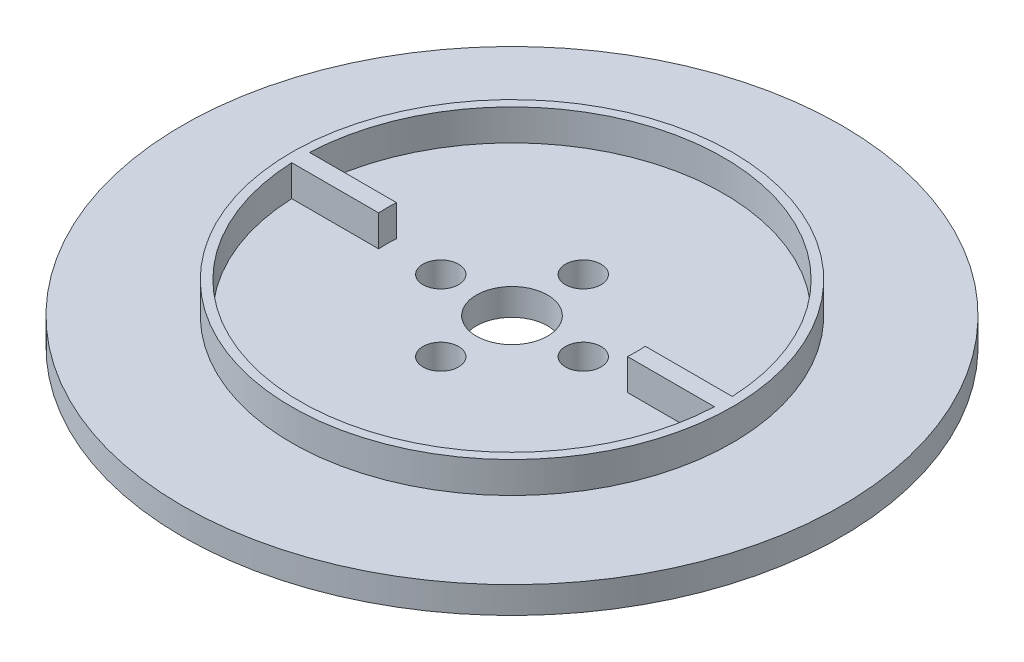
ISO-10303-21;
HEADER;
FILE_DESCRIPTION(('STEP AP214'),'2;1');
FILE_NAME('part.step','',(''),(''),'','','');
FILE_SCHEMA(('AUTOMOTIVE_DESIGN { 1 0 10303 214 1 1 1 1 }'));
ENDSEC;
DATA;
#1=APPLICATION_CONTEXT('core data for automotive mechanical design processes');
#2=APPLICATION_PROTOCOL_DEFINITION('international standard','automotive_design',2000,#1);
#3=PRODUCT_CONTEXT('',#1,'mechanical');
#4=PRODUCT('Part','Part','',(#3));
#5=PRODUCT_RELATED_PRODUCT_CATEGORY('part','',(#4));
#6=PRODUCT_DEFINITION_FORMATION('','',#4);
#7=PRODUCT_DEFINITION_CONTEXT('part definition',#1,'design');
#8=PRODUCT_DEFINITION('design','',#6,#7);
#9=PRODUCT_DEFINITION_SHAPE('','',#8);
#10=(LENGTH_UNIT() NAMED_UNIT(*) SI_UNIT(.MILLI.,.METRE.));
#11=(NAMED_UNIT(*) PLANE_ANGLE_UNIT() SI_UNIT($,.RADIAN.));
#12=(NAMED_UNIT(*) SI_UNIT($,.STERADIAN.) SOLID_ANGLE_UNIT());
#13=UNCERTAINTY_MEASURE_WITH_UNIT(LENGTH_MEASURE(1.E-05),#10,'distance_accuracy_value','');
#14=(GEOMETRIC_REPRESENTATION_CONTEXT(3) GLOBAL_UNCERTAINTY_ASSIGNED_CONTEXT((#13)) GLOBAL_UNIT_ASSIGNED_CONTEXT((#10,
#11,#12)) REPRESENTATION_CONTEXT('',''));
#15=CARTESIAN_POINT('',(0.,0.,0.));
#16=DIRECTION('',(0.,0.,1.));
#17=DIRECTION('',(1.,0.,0.));
#18=AXIS2_PLACEMENT_3D('',#15,#16,#17);
#19=CARTESIAN_POINT('',(0.,3.,0.));
#20=DIRECTION('',(0.,1.,0.));
#21=DIRECTION('',(0.,0.,1.));
#22=AXIS2_PLACEMENT_3D('',#19,#20,#21);
#23=PLANE('',#22);
#24=CARTESIAN_POINT('',(0.,3.,0.));
#25=DIRECTION('',(0.,1.,0.));
#26=DIRECTION('',(0.,0.,1.));
#27=AXIS2_PLACEMENT_3D('',#24,#25,#26);
#28=CIRCLE('',#27,37.);
#29=CARTESIAN_POINT('',(0.,3.,37.));
#30=VERTEX_POINT('',#29);
#31=EDGE_CURVE('E11',#30,#30,#28,.T.);
#32=ORIENTED_EDGE('',*,*,#31,.T.);
#33=EDGE_LOOP('',(#32));
#34=FACE_BOUND('',#33,.T.);
#35=CARTESIAN_POINT('',(0.,3.,0.));
#36=DIRECTION('',(0.,1.,0.));
#37=DIRECTION('',(0.,0.,1.));
#38=AXIS2_PLACEMENT_3D('',#35,#36,#37);
#39=CIRCLE('',#38,24.75);
#40=CARTESIAN_POINT('',(0.,3.,-24.75));
#41=VERTEX_POINT('',#40);
#42=EDGE_CURVE('E185',#41,#41,#39,.F.);
#43=ORIENTED_EDGE('',*,*,#42,.T.);
#44=EDGE_LOOP('',(#43));
#45=FACE_BOUND('',#44,.T.);
#46=ADVANCED_FACE('F41',(#34,#45),#23,.T.);
#47=CARTESIAN_POINT('',(0.,3.,0.));
#48=DIRECTION('',(0.,-1.,0.));
#49=DIRECTION('',(0.,0.,-1.));
#50=AXIS2_PLACEMENT_3D('',#47,#48,#49);
#51=CYLINDRICAL_SURFACE('',#50,37.);
#52=ORIENTED_EDGE('',*,*,#31,.F.);
#53=EDGE_LOOP('',(#52));
#54=FACE_BOUND('',#53,.T.);
#55=CARTESIAN_POINT('',(0.,0.,0.));
#56=DIRECTION('',(0.,1.,0.));
#57=DIRECTION('',(0.,0.,1.));
#58=AXIS2_PLACEMENT_3D('',#55,#56,#57);
#59=CIRCLE('',#58,37.);
#60=CARTESIAN_POINT('',(0.,0.,37.));
#61=VERTEX_POINT('',#60);
#62=EDGE_CURVE('E51',#61,#61,#59,.T.);
#63=ORIENTED_EDGE('',*,*,#62,.T.);
#64=EDGE_LOOP('',(#63));
#65=FACE_BOUND('',#64,.T.);
#66=ADVANCED_FACE('F43',(#54,#65),#51,.T.);
#67=CARTESIAN_POINT('',(0.,0.,0.));
#68=DIRECTION('',(0.,1.,0.));
#69=DIRECTION('',(0.,0.,1.));
#70=AXIS2_PLACEMENT_3D('',#67,#68,#69);
#71=PLANE('',#70);
#72=CARTESIAN_POINT('',(8.,0.,0.));
#73=DIRECTION('',(0.,1.,0.));
#74=DIRECTION('',(0.,0.,1.));
#75=AXIS2_PLACEMENT_3D('',#72,#73,#74);
#76=CIRCLE('',#75,2.);
#77=CARTESIAN_POINT('',(8.,0.,2.));
#78=VERTEX_POINT('',#77);
#79=EDGE_CURVE('E307',#78,#78,#76,.T.);
#80=ORIENTED_EDGE('',*,*,#79,.T.);
#81=EDGE_LOOP('',(#80));
#82=FACE_BOUND('',#81,.T.);
#83=CARTESIAN_POINT('',(0.,0.,8.));
#84=DIRECTION('',(0.,1.,0.));
#85=DIRECTION('',(0.,0.,1.));
#86=AXIS2_PLACEMENT_3D('',#83,#84,#85);
#87=CIRCLE('',#86,2.);
#88=CARTESIAN_POINT('',(0.,0.,10.));
#89=VERTEX_POINT('',#88);
#90=EDGE_CURVE('E311',#89,#89,#87,.T.);
#91=ORIENTED_EDGE('',*,*,#90,.T.);
#92=EDGE_LOOP('',(#91));
#93=FACE_BOUND('',#92,.T.);
#94=CARTESIAN_POINT('',(-8.,0.,0.));
#95=DIRECTION('',(0.,1.,0.));
#96=DIRECTION('',(0.,0.,1.));
#97=AXIS2_PLACEMENT_3D('',#94,#95,#96);
#98=CIRCLE('',#97,2.);
#99=CARTESIAN_POINT('',(-8.,0.,1.99999999999994));
#100=VERTEX_POINT('',#99);
#101=EDGE_CURVE('E315',#100,#100,#98,.T.);
#102=ORIENTED_EDGE('',*,*,#101,.T.);
#103=EDGE_LOOP('',(#102));
#104=FACE_BOUND('',#103,.T.);
#105=CARTESIAN_POINT('',(0.,0.,-8.));
#106=DIRECTION('',(0.,1.,0.));
#107=DIRECTION('',(0.,0.,1.));
#108=AXIS2_PLACEMENT_3D('',#105,#106,#107);
#109=CIRCLE('',#108,2.);
#110=CARTESIAN_POINT('',(0.,0.,-6.));
#111=VERTEX_POINT('',#110);
#112=EDGE_CURVE('E319',#111,#111,#109,.T.);
#113=ORIENTED_EDGE('',*,*,#112,.T.);
#114=EDGE_LOOP('',(#113));
#115=FACE_BOUND('',#114,.T.);
#116=CARTESIAN_POINT('',(0.,0.,0.));
#117=DIRECTION('',(0.,1.,0.));
#118=DIRECTION('',(0.,0.,1.));
#119=AXIS2_PLACEMENT_3D('',#116,#117,#118);
#120=CIRCLE('',#119,4.);
#121=CARTESIAN_POINT('',(0.,0.,4.));
#122=VERTEX_POINT('',#121);
#123=EDGE_CURVE('E45',#122,#122,#120,.T.);
#124=ORIENTED_EDGE('',*,*,#123,.T.);
#125=EDGE_LOOP('',(#124));
#126=FACE_BOUND('',#125,.T.);
#127=ORIENTED_EDGE('',*,*,#62,.F.);
#128=EDGE_LOOP('',(#127));
#129=FACE_BOUND('',#128,.T.);
#130=ADVANCED_FACE('F213',(#82,#93,#104,#115,#126,#129),#71,.F.);
#131=CARTESIAN_POINT('',(0.,6.5,0.));
#132=DIRECTION('',(0.,-1.,0.));
#133=DIRECTION('',(0.,0.,-1.));
#134=AXIS2_PLACEMENT_3D('',#131,#132,#133);
#135=CYLINDRICAL_SURFACE('',#134,23.75);
#136=DIRECTION('',(0.,-1.,0.));
#137=VECTOR('',#136,1.);
#138=CARTESIAN_POINT('',(-23.7289380293346,6.5,-1.));
#139=LINE('',#138,#137);
#140=CARTESIAN_POINT('',(-23.7289380293346,6.5,-1.));
#141=VERTEX_POINT('',#140);
#142=CARTESIAN_POINT('',(-23.7289380293346,3.,-1.));
#143=VERTEX_POINT('',#142);
#144=EDGE_CURVE('E157',#141,#143,#139,.T.);
#145=ORIENTED_EDGE('',*,*,#144,.T.);
#146=CARTESIAN_POINT('',(0.,3.,0.));
#147=DIRECTION('',(0.,1.,0.));
#148=DIRECTION('',(0.,0.,1.));
#149=AXIS2_PLACEMENT_3D('',#146,#147,#148);
#150=CIRCLE('',#149,23.75);
#151=CARTESIAN_POINT('',(23.7289380293346,3.,-1.));
#152=VERTEX_POINT('',#151);
#153=EDGE_CURVE('E113',#143,#152,#150,.F.);
#154=ORIENTED_EDGE('',*,*,#153,.T.);
#155=DIRECTION('',(0.,-1.,0.));
#156=VECTOR('',#155,1.);
#157=CARTESIAN_POINT('',(23.7289380293346,6.5,-1.));
#158=LINE('',#157,#156);
#159=CARTESIAN_POINT('',(23.7289380293346,6.5,-1.));
#160=VERTEX_POINT('',#159);
#161=EDGE_CURVE('E107',#160,#152,#158,.T.);
#162=ORIENTED_EDGE('',*,*,#161,.F.);
#163=CARTESIAN_POINT('',(0.,6.5,0.));
#164=DIRECTION('',(0.,1.,0.));
#165=DIRECTION('',(0.,0.,1.));
#166=AXIS2_PLACEMENT_3D('',#163,#164,#165);
#167=CIRCLE('',#166,23.75);
#168=EDGE_CURVE('E111',#160,#141,#167,.T.);
#169=ORIENTED_EDGE('',*,*,#168,.T.);
#170=EDGE_LOOP('',(#145,#154,#162,#169));
#171=FACE_BOUND('',#170,.T.);
#172=ADVANCED_FACE('F110',(#171),#135,.F.);
#173=CARTESIAN_POINT('',(0.,6.5,-1.));
#174=DIRECTION('',(0.,0.,-1.));
#175=DIRECTION('',(-1.,0.,0.));
#176=AXIS2_PLACEMENT_3D('',#173,#174,#175);
#177=PLANE('',#176);
#178=ORIENTED_EDGE('',*,*,#161,.T.);
#179=DIRECTION('',(-1.,0.,0.));
#180=VECTOR('',#179,1.);
#181=CARTESIAN_POINT('',(0.,3.,-1.));
#182=LINE('',#181,#180);
#183=CARTESIAN_POINT('',(13.9642400437689,3.,-1.));
#184=VERTEX_POINT('',#183);
#185=EDGE_CURVE('E59',#152,#184,#182,.T.);
#186=ORIENTED_EDGE('',*,*,#185,.T.);
#187=DIRECTION('',(0.,-1.,0.));
#188=VECTOR('',#187,1.);
#189=CARTESIAN_POINT('',(13.9642400437689,6.5,-1.));
#190=LINE('',#189,#188);
#191=CARTESIAN_POINT('',(13.9642400437689,6.5,-1.));
#192=VERTEX_POINT('',#191);
#193=EDGE_CURVE('E118',#192,#184,#190,.T.);
#194=ORIENTED_EDGE('',*,*,#193,.F.);
#195=DIRECTION('',(1.,0.,0.));
#196=VECTOR('',#195,1.);
#197=CARTESIAN_POINT('',(0.,6.5,-1.));
#198=LINE('',#197,#196);
#199=EDGE_CURVE('E124',#192,#160,#198,.T.);
#200=ORIENTED_EDGE('',*,*,#199,.T.);
#201=EDGE_LOOP('',(#178,#186,#194,#200));
#202=FACE_BOUND('',#201,.T.);
#203=ADVANCED_FACE('F132',(#202),#177,.T.);
#204=CARTESIAN_POINT('',(0.,6.5,0.));
#205=DIRECTION('',(0.,-1.,0.));
#206=DIRECTION('',(0.,0.,-1.));
#207=AXIS2_PLACEMENT_3D('',#204,#205,#206);
#208=CYLINDRICAL_SURFACE('',#207,14.);
#209=ORIENTED_EDGE('',*,*,#193,.T.);
#210=CARTESIAN_POINT('',(0.,3.,0.));
#211=DIRECTION('',(0.,1.,0.));
#212=DIRECTION('',(0.,0.,1.));
#213=AXIS2_PLACEMENT_3D('',#210,#211,#212);
#214=CIRCLE('',#213,14.);
#215=CARTESIAN_POINT('',(13.9642400437689,3.,1.));
#216=VERTEX_POINT('',#215);
#217=EDGE_CURVE('E64',#184,#216,#214,.F.);
#218=ORIENTED_EDGE('',*,*,#217,.T.);
#219=DIRECTION('',(0.,-1.,0.));
#220=VECTOR('',#219,1.);
#221=CARTESIAN_POINT('',(13.9642400437689,6.5,1.));
#222=LINE('',#221,#220);
#223=CARTESIAN_POINT('',(13.9642400437689,6.5,1.));
#224=VERTEX_POINT('',#223);
#225=EDGE_CURVE('E176',#224,#216,#222,.T.);
#226=ORIENTED_EDGE('',*,*,#225,.F.);
#227=CARTESIAN_POINT('',(0.,6.5,0.));
#228=DIRECTION('',(0.,1.,0.));
#229=DIRECTION('',(0.,0.,1.));
#230=AXIS2_PLACEMENT_3D('',#227,#228,#229);
#231=CIRCLE('',#230,14.);
#232=EDGE_CURVE('E135',#224,#192,#231,.T.);
#233=ORIENTED_EDGE('',*,*,#232,.T.);
#234=EDGE_LOOP('',(#209,#218,#226,#233));
#235=FACE_BOUND('',#234,.T.);
#236=ADVANCED_FACE('F281',(#235),#208,.F.);
#237=CARTESIAN_POINT('',(0.,6.5,1.));
#238=DIRECTION('',(0.,0.,-1.));
#239=DIRECTION('',(-1.,0.,0.));
#240=AXIS2_PLACEMENT_3D('',#237,#238,#239);
#241=PLANE('',#240);
#242=DIRECTION('',(-1.,0.,0.));
#243=VECTOR('',#242,1.);
#244=CARTESIAN_POINT('',(0.,3.,1.));
#245=LINE('',#244,#243);
#246=CARTESIAN_POINT('',(23.7289380293346,3.,1.));
#247=VERTEX_POINT('',#246);
#248=EDGE_CURVE('E200',#247,#216,#245,.T.);
#249=ORIENTED_EDGE('',*,*,#248,.F.);
#250=DIRECTION('',(0.,-1.,0.));
#251=VECTOR('',#250,1.);
#252=CARTESIAN_POINT('',(23.7289380293346,6.5,1.));
#253=LINE('',#252,#251);
#254=CARTESIAN_POINT('',(23.7289380293346,6.5,1.));
#255=VERTEX_POINT('',#254);
#256=EDGE_CURVE('E172',#255,#247,#253,.T.);
#257=ORIENTED_EDGE('',*,*,#256,.F.);
#258=DIRECTION('',(1.,0.,0.));
#259=VECTOR('',#258,1.);
#260=CARTESIAN_POINT('',(0.,6.5,1.));
#261=LINE('',#260,#259);
#262=EDGE_CURVE('E138',#224,#255,#261,.T.);
#263=ORIENTED_EDGE('',*,*,#262,.F.);
#264=ORIENTED_EDGE('',*,*,#225,.T.);
#265=EDGE_LOOP('',(#249,#257,#263,#264));
#266=FACE_BOUND('',#265,.T.);
#267=ADVANCED_FACE('F279',(#266),#241,.F.);
#268=CARTESIAN_POINT('',(0.,6.5,0.));
#269=DIRECTION('',(0.,-1.,0.));
#270=DIRECTION('',(0.,0.,-1.));
#271=AXIS2_PLACEMENT_3D('',#268,#269,#270);
#272=CYLINDRICAL_SURFACE('',#271,23.75);
#273=ORIENTED_EDGE('',*,*,#256,.T.);
#274=CARTESIAN_POINT('',(0.,3.,0.));
#275=DIRECTION('',(0.,1.,0.));
#276=DIRECTION('',(0.,0.,1.));
#277=AXIS2_PLACEMENT_3D('',#274,#275,#276);
#278=CIRCLE('',#277,23.75);
#279=CARTESIAN_POINT('',(-23.7289380293346,3.,1.));
#280=VERTEX_POINT('',#279);
#281=EDGE_CURVE('E196',#247,#280,#278,.F.);
#282=ORIENTED_EDGE('',*,*,#281,.T.);
#283=DIRECTION('',(0.,-1.,0.));
#284=VECTOR('',#283,1.);
#285=CARTESIAN_POINT('',(-23.7289380293346,6.5,1.));
#286=LINE('',#285,#284);
#287=CARTESIAN_POINT('',(-23.7289380293346,6.5,1.));
#288=VERTEX_POINT('',#287);
#289=EDGE_CURVE('E168',#288,#280,#286,.T.);
#290=ORIENTED_EDGE('',*,*,#289,.F.);
#291=CARTESIAN_POINT('',(0.,6.5,0.));
#292=DIRECTION('',(0.,1.,0.));
#293=DIRECTION('',(0.,0.,1.));
#294=AXIS2_PLACEMENT_3D('',#291,#292,#293);
#295=CIRCLE('',#294,23.75);
#296=EDGE_CURVE('E144',#288,#255,#295,.T.);
#297=ORIENTED_EDGE('',*,*,#296,.T.);
#298=EDGE_LOOP('',(#273,#282,#290,#297));
#299=FACE_BOUND('',#298,.T.);
#300=ADVANCED_FACE('F275',(#299),#272,.F.);
#301=CARTESIAN_POINT('',(0.,6.5,1.));
#302=DIRECTION('',(0.,0.,-1.));
#303=DIRECTION('',(-1.,0.,0.));
#304=AXIS2_PLACEMENT_3D('',#301,#302,#303);
#305=PLANE('',#304);
#306=DIRECTION('',(-1.,0.,0.));
#307=VECTOR('',#306,1.);
#308=CARTESIAN_POINT('',(0.,3.,1.));
#309=LINE('',#308,#307);
#310=CARTESIAN_POINT('',(-13.9642400437689,3.,1.));
#311=VERTEX_POINT('',#310);
#312=EDGE_CURVE('E193',#311,#280,#309,.T.);
#313=ORIENTED_EDGE('',*,*,#312,.F.);
#314=DIRECTION('',(0.,-1.,0.));
#315=VECTOR('',#314,1.);
#316=CARTESIAN_POINT('',(-13.9642400437689,6.5,1.));
#317=LINE('',#316,#315);
#318=CARTESIAN_POINT('',(-13.9642400437689,6.5,1.));
#319=VERTEX_POINT('',#318);
#320=EDGE_CURVE('E164',#319,#311,#317,.T.);
#321=ORIENTED_EDGE('',*,*,#320,.F.);
#322=DIRECTION('',(1.,0.,0.));
#323=VECTOR('',#322,1.);
#324=CARTESIAN_POINT('',(0.,6.5,1.));
#325=LINE('',#324,#323);
#326=EDGE_CURVE('E148',#288,#319,#325,.T.);
#327=ORIENTED_EDGE('',*,*,#326,.F.);
#328=ORIENTED_EDGE('',*,*,#289,.T.);
#329=EDGE_LOOP('',(#313,#321,#327,#328));
#330=FACE_BOUND('',#329,.T.);
#331=ADVANCED_FACE('F272',(#330),#305,.F.);
#332=CARTESIAN_POINT('',(0.,6.5,0.));
#333=DIRECTION('',(0.,-1.,0.));
#334=DIRECTION('',(0.,0.,-1.));
#335=AXIS2_PLACEMENT_3D('',#332,#333,#334);
#336=CYLINDRICAL_SURFACE('',#335,14.);
#337=ORIENTED_EDGE('',*,*,#320,.T.);
#338=CARTESIAN_POINT('',(0.,3.,0.));
#339=DIRECTION('',(0.,1.,0.));
#340=DIRECTION('',(0.,0.,1.));
#341=AXIS2_PLACEMENT_3D('',#338,#339,#340);
#342=CIRCLE('',#341,14.);
#343=CARTESIAN_POINT('',(-13.9642400437689,3.,-1.));
#344=VERTEX_POINT('',#343);
#345=EDGE_CURVE('E189',#311,#344,#342,.F.);
#346=ORIENTED_EDGE('',*,*,#345,.T.);
#347=DIRECTION('',(0.,-1.,0.));
#348=VECTOR('',#347,1.);
#349=CARTESIAN_POINT('',(-13.9642400437689,6.5,-1.));
#350=LINE('',#349,#348);
#351=CARTESIAN_POINT('',(-13.9642400437689,6.5,-1.));
#352=VERTEX_POINT('',#351);
#353=EDGE_CURVE('E160',#352,#344,#350,.T.);
#354=ORIENTED_EDGE('',*,*,#353,.F.);
#355=CARTESIAN_POINT('',(0.,6.5,0.));
#356=DIRECTION('',(0.,1.,0.));
#357=DIRECTION('',(0.,0.,1.));
#358=AXIS2_PLACEMENT_3D('',#355,#356,#357);
#359=CIRCLE('',#358,14.);
#360=EDGE_CURVE('E151',#352,#319,#359,.T.);
#361=ORIENTED_EDGE('',*,*,#360,.T.);
#362=EDGE_LOOP('',(#337,#346,#354,#361));
#363=FACE_BOUND('',#362,.T.);
#364=ADVANCED_FACE('F266',(#363),#336,.F.);
#365=CARTESIAN_POINT('',(0.,6.5,0.));
#366=DIRECTION('',(0.,-1.,0.));
#367=DIRECTION('',(0.,0.,-1.));
#368=AXIS2_PLACEMENT_3D('',#365,#366,#367);
#369=CYLINDRICAL_SURFACE('',#368,24.75);
#370=CARTESIAN_POINT('',(0.,6.5,0.));
#371=DIRECTION('',(0.,1.,0.));
#372=DIRECTION('',(0.,0.,1.));
#373=AXIS2_PLACEMENT_3D('',#370,#371,#372);
#374=CIRCLE('',#373,24.75);
#375=CARTESIAN_POINT('',(0.,6.5,-24.75));
#376=VERTEX_POINT('',#375);
#377=EDGE_CURVE('E130',#376,#376,#374,.T.);
#378=CARTESIAN_POINT('',(0.,3.,-24.75));
#379=CARTESIAN_POINT('',(0.,3.03645833333333,-24.75));
#380=CARTESIAN_POINT('',(0.,3.07291666666667,-24.75));
#381=CARTESIAN_POINT('',(0.,3.14583333333333,-24.75));
#382=CARTESIAN_POINT('',(0.,3.18229166666667,-24.75));
#383=CARTESIAN_POINT('',(0.,3.25520833333333,-24.75));
#384=CARTESIAN_POINT('',(0.,3.29166666666667,-24.75));
#385=CARTESIAN_POINT('',(0.,3.36458333333333,-24.75));
#386=CARTESIAN_POINT('',(0.,3.40104166666667,-24.75));
#387=CARTESIAN_POINT('',(0.,3.47395833333333,-24.75));
#388=CARTESIAN_POINT('',(0.,3.51041666666667,-24.75));
#389=CARTESIAN_POINT('',(0.,3.58333333333333,-24.75));
#390=CARTESIAN_POINT('',(0.,3.61979166666667,-24.75));
#391=CARTESIAN_POINT('',(0.,3.69270833333333,-24.75));
#392=CARTESIAN_POINT('',(0.,3.72916666666667,-24.75));
#393=CARTESIAN_POINT('',(0.,3.80208333333333,-24.75));
#394=CARTESIAN_POINT('',(0.,3.83854166666667,-24.75));
#395=CARTESIAN_POINT('',(0.,3.91145833333333,-24.75));
#396=CARTESIAN_POINT('',(0.,3.94791666666667,-24.75));
#397=CARTESIAN_POINT('',(0.,4.02083333333333,-24.75));
#398=CARTESIAN_POINT('',(0.,4.05729166666667,-24.75));
#399=CARTESIAN_POINT('',(0.,4.13020833333333,-24.75));
#400=CARTESIAN_POINT('',(0.,4.16666666666667,-24.75));
#401=CARTESIAN_POINT('',(0.,4.23958333333333,-24.75));
#402=CARTESIAN_POINT('',(0.,4.27604166666667,-24.75));
#403=CARTESIAN_POINT('',(0.,4.34895833333333,-24.75));
#404=CARTESIAN_POINT('',(0.,4.38541666666667,-24.75));
#405=CARTESIAN_POINT('',(0.,4.45833333333333,-24.75));
#406=CARTESIAN_POINT('',(0.,4.49479166666667,-24.75));
#407=CARTESIAN_POINT('',(0.,4.56770833333333,-24.75));
#408=CARTESIAN_POINT('',(0.,4.60416666666667,-24.75));
#409=CARTESIAN_POINT('',(0.,4.67708333333333,-24.75));
#410=CARTESIAN_POINT('',(0.,4.71354166666667,-24.75));
#411=CARTESIAN_POINT('',(0.,4.78645833333333,-24.75));
#412=CARTESIAN_POINT('',(0.,4.82291666666667,-24.75));
#413=CARTESIAN_POINT('',(0.,4.89583333333333,-24.75));
#414=CARTESIAN_POINT('',(0.,4.93229166666667,-24.75));
#415=CARTESIAN_POINT('',(0.,5.00520833333333,-24.75));
#416=CARTESIAN_POINT('',(0.,5.04166666666667,-24.75));
#417=CARTESIAN_POINT('',(0.,5.11458333333333,-24.75));
#418=CARTESIAN_POINT('',(0.,5.15104166666667,-24.75));
#419=CARTESIAN_POINT('',(0.,5.22395833333333,-24.75));
#420=CARTESIAN_POINT('',(0.,5.26041666666667,-24.75));
#421=CARTESIAN_POINT('',(0.,5.33333333333333,-24.75));
#422=CARTESIAN_POINT('',(0.,5.36979166666667,-24.75));
#423=CARTESIAN_POINT('',(0.,5.44270833333333,-24.75));
#424=CARTESIAN_POINT('',(0.,5.47916666666667,-24.75));
#425=CARTESIAN_POINT('',(0.,5.55208333333333,-24.75));
#426=CARTESIAN_POINT('',(0.,5.58854166666667,-24.75));
#427=CARTESIAN_POINT('',(0.,5.66145833333333,-24.75));
#428=CARTESIAN_POINT('',(0.,5.69791666666667,-24.75));
#429=CARTESIAN_POINT('',(0.,5.77083333333333,-24.75));
#430=CARTESIAN_POINT('',(0.,5.80729166666667,-24.75));
#431=CARTESIAN_POINT('',(0.,5.88020833333333,-24.75));
#432=CARTESIAN_POINT('',(0.,5.91666666666667,-24.75));
#433=CARTESIAN_POINT('',(0.,5.98958333333333,-24.75));
#434=CARTESIAN_POINT('',(0.,6.02604166666667,-24.75));
#435=CARTESIAN_POINT('',(0.,6.09895833333333,-24.75));
#436=CARTESIAN_POINT('',(0.,6.13541666666667,-24.75));
#437=CARTESIAN_POINT('',(0.,6.20833333333333,-24.75));
#438=CARTESIAN_POINT('',(0.,6.24479166666667,-24.75));
#439=CARTESIAN_POINT('',(0.,6.31770833333333,-24.75));
#440=CARTESIAN_POINT('',(0.,6.35416666666667,-24.75));
#441=CARTESIAN_POINT('',(0.,6.42708333333333,-24.75));
#442=CARTESIAN_POINT('',(0.,6.46354166666667,-24.75));
#443=CARTESIAN_POINT('',(0.,6.5,-24.75));
#444=B_SPLINE_CURVE_WITH_KNOTS('',3,(#378,#379,#380,#381,#382,#383,#384,#385,#386,#387,#388,
#389,#390,#391,#392,#393,#394,#395,#396,#397,#398,#399,#400,#401,#402,#403,#404,#405,#406,#407,
#408,#409,#410,#411,#412,#413,#414,#415,#416,#417,#418,#419,#420,#421,#422,#423,#424,#425,#426,
#427,#428,#429,#430,#431,#432,#433,#434,#435,#436,#437,#438,#439,#440,#441,#442,#443),
.UNSPECIFIED.,.F.,.F.,(4,2,2,2,2,2,2,2,2,2,2,2,2,2,2,2,2,2,2,2,2,2,2,2,2,2,2,2,2,2,2,2,4),(0.,
0.109375,0.21875,0.328125,0.4375,0.546875,0.65625,0.765625,0.875,0.984375,1.09375,1.203125,
1.3125,1.421875,1.53125,1.640625,1.75,1.859375,1.96875,2.078125,2.1875,2.296875,2.40625,
2.515625,2.625,2.734375,2.84375,2.953125,3.0625,3.171875,3.28125,3.390625,3.5),.UNSPECIFIED.);
#445=EDGE_CURVE('BSEAM291',#41,#376,#444,.T.);
#446=ORIENTED_EDGE('',*,*,#42,.F.);
#447=ORIENTED_EDGE('',*,*,#377,.F.);
#448=ORIENTED_EDGE('',*,*,#445,.T.);
#449=ORIENTED_EDGE('',*,*,#445,.F.);
#450=EDGE_LOOP('',(#446,#448,#447,#449));
#451=FACE_BOUND('',#450,.T.);
#452=ADVANCED_FACE('F291',(#451),#369,.T.);
#453=CARTESIAN_POINT('',(0.,6.5,-1.));
#454=DIRECTION('',(0.,0.,-1.));
#455=DIRECTION('',(-1.,0.,0.));
#456=AXIS2_PLACEMENT_3D('',#453,#454,#455);
#457=PLANE('',#456);
#458=ORIENTED_EDGE('',*,*,#353,.T.);
#459=DIRECTION('',(-1.,0.,0.));
#460=VECTOR('',#459,1.);
#461=CARTESIAN_POINT('',(0.,3.,-1.));
#462=LINE('',#461,#460);
#463=EDGE_CURVE('E117',#344,#143,#462,.T.);
#464=ORIENTED_EDGE('',*,*,#463,.T.);
#465=ORIENTED_EDGE('',*,*,#144,.F.);
#466=DIRECTION('',(1.,0.,0.));
#467=VECTOR('',#466,1.);
#468=CARTESIAN_POINT('',(0.,6.5,-1.));
#469=LINE('',#468,#467);
#470=EDGE_CURVE('E128',#141,#352,#469,.T.);
#471=ORIENTED_EDGE('',*,*,#470,.T.);
#472=EDGE_LOOP('',(#458,#464,#465,#471));
#473=FACE_BOUND('',#472,.T.);
#474=ADVANCED_FACE('F242',(#473),#457,.T.);
#475=CARTESIAN_POINT('',(0.,6.5,0.));
#476=DIRECTION('',(0.,1.,0.));
#477=DIRECTION('',(0.,0.,1.));
#478=AXIS2_PLACEMENT_3D('',#475,#476,#477);
#479=PLANE('',#478);
#480=ORIENTED_EDGE('',*,*,#377,.T.);
#481=EDGE_LOOP('',(#480));
#482=FACE_BOUND('',#481,.T.);
#483=ORIENTED_EDGE('',*,*,#168,.F.);
#484=ORIENTED_EDGE('',*,*,#199,.F.);
#485=ORIENTED_EDGE('',*,*,#232,.F.);
#486=ORIENTED_EDGE('',*,*,#262,.T.);
#487=ORIENTED_EDGE('',*,*,#296,.F.);
#488=ORIENTED_EDGE('',*,*,#326,.T.);
#489=ORIENTED_EDGE('',*,*,#360,.F.);
#490=ORIENTED_EDGE('',*,*,#470,.F.);
#491=EDGE_LOOP('',(#483,#484,#485,#486,#487,#488,#489,#490));
#492=FACE_BOUND('',#491,.T.);
#493=ADVANCED_FACE('F122',(#482,#492),#479,.T.);
#494=CARTESIAN_POINT('',(0.,3.,0.));
#495=DIRECTION('',(0.,1.,0.));
#496=DIRECTION('',(0.,0.,1.));
#497=AXIS2_PLACEMENT_3D('',#494,#495,#496);
#498=CIRCLE('',#497,4.);
#499=CARTESIAN_POINT('',(0.,3.,4.));
#500=VERTEX_POINT('',#499);
#501=EDGE_CURVE('E248',#500,#500,#498,.T.);
#502=ORIENTED_EDGE('',*,*,#501,.F.);
#503=EDGE_LOOP('',(#502));
#504=FACE_BOUND('',#503,.T.);
#505=CARTESIAN_POINT('',(8.,3.,0.));
#506=DIRECTION('',(0.,1.,0.));
#507=DIRECTION('',(0.,0.,1.));
#508=AXIS2_PLACEMENT_3D('',#505,#506,#507);
#509=CIRCLE('',#508,2.);
#510=CARTESIAN_POINT('',(8.,3.,2.));
#511=VERTEX_POINT('',#510);
#512=EDGE_CURVE('E252',#511,#511,#509,.T.);
#513=ORIENTED_EDGE('',*,*,#512,.F.);
#514=EDGE_LOOP('',(#513));
#515=FACE_BOUND('',#514,.T.);
#516=CARTESIAN_POINT('',(0.,3.,8.));
#517=DIRECTION('',(0.,1.,0.));
#518=DIRECTION('',(0.,0.,1.));
#519=AXIS2_PLACEMENT_3D('',#516,#517,#518);
#520=CIRCLE('',#519,2.);
#521=CARTESIAN_POINT('',(0.,3.,10.));
#522=VERTEX_POINT('',#521);
#523=EDGE_CURVE('E256',#522,#522,#520,.T.);
#524=ORIENTED_EDGE('',*,*,#523,.F.);
#525=EDGE_LOOP('',(#524));
#526=FACE_BOUND('',#525,.T.);
#527=CARTESIAN_POINT('',(-8.,3.,0.));
#528=DIRECTION('',(0.,1.,0.));
#529=DIRECTION('',(0.,0.,1.));
#530=AXIS2_PLACEMENT_3D('',#527,#528,#529);
#531=CIRCLE('',#530,2.);
#532=CARTESIAN_POINT('',(-8.,3.,1.99999999999994));
#533=VERTEX_POINT('',#532);
#534=EDGE_CURVE('E260',#533,#533,#531,.T.);
#535=ORIENTED_EDGE('',*,*,#534,.F.);
#536=EDGE_LOOP('',(#535));
#537=FACE_BOUND('',#536,.T.);
#538=CARTESIAN_POINT('',(0.,3.,-8.));
#539=DIRECTION('',(0.,1.,0.));
#540=DIRECTION('',(0.,0.,1.));
#541=AXIS2_PLACEMENT_3D('',#538,#539,#540);
#542=CIRCLE('',#541,2.);
#543=CARTESIAN_POINT('',(0.,3.,-6.));
#544=VERTEX_POINT('',#543);
#545=EDGE_CURVE('E263',#544,#544,#542,.T.);
#546=ORIENTED_EDGE('',*,*,#545,.F.);
#547=EDGE_LOOP('',(#546));
#548=FACE_BOUND('',#547,.T.);
#549=ORIENTED_EDGE('',*,*,#153,.F.);
#550=ORIENTED_EDGE('',*,*,#463,.F.);
#551=ORIENTED_EDGE('',*,*,#345,.F.);
#552=ORIENTED_EDGE('',*,*,#312,.T.);
#553=ORIENTED_EDGE('',*,*,#281,.F.);
#554=ORIENTED_EDGE('',*,*,#248,.T.);
#555=ORIENTED_EDGE('',*,*,#217,.F.);
#556=ORIENTED_EDGE('',*,*,#185,.F.);
#557=EDGE_LOOP('',(#549,#550,#551,#552,#553,#554,#555,#556));
#558=FACE_BOUND('',#557,.T.);
#559=ADVANCED_FACE('F227',(#504,#515,#526,#537,#548,#558),#23,.T.);
#560=CARTESIAN_POINT('',(0.,-3.5,-8.));
#561=DIRECTION('',(0.,1.,0.));
#562=DIRECTION('',(0.,0.,1.));
#563=AXIS2_PLACEMENT_3D('',#560,#561,#562);
#564=CYLINDRICAL_SURFACE('',#563,2.);
#565=CARTESIAN_POINT('',(0.,3.,-6.));
#566=CARTESIAN_POINT('',(0.,2.96875,-6.));
#567=CARTESIAN_POINT('',(0.,2.9375,-6.));
#568=CARTESIAN_POINT('',(0.,2.875,-6.));
#569=CARTESIAN_POINT('',(0.,2.84375,-6.));
#570=CARTESIAN_POINT('',(0.,2.78125,-6.));
#571=CARTESIAN_POINT('',(0.,2.75,-6.));
#572=CARTESIAN_POINT('',(0.,2.6875,-6.));
#573=CARTESIAN_POINT('',(0.,2.65625,-6.));
#574=CARTESIAN_POINT('',(0.,2.59375,-6.));
#575=CARTESIAN_POINT('',(0.,2.5625,-6.));
#576=CARTESIAN_POINT('',(0.,2.5,-6.));
#577=CARTESIAN_POINT('',(0.,2.46875,-6.));
#578=CARTESIAN_POINT('',(0.,2.40625,-6.));
#579=CARTESIAN_POINT('',(0.,2.375,-6.));
#580=CARTESIAN_POINT('',(0.,2.3125,-6.));
#581=CARTESIAN_POINT('',(0.,2.28125,-6.));
#582=CARTESIAN_POINT('',(0.,2.21875,-6.));
#583=CARTESIAN_POINT('',(0.,2.1875,-6.));
#584=CARTESIAN_POINT('',(0.,2.125,-6.));
#585=CARTESIAN_POINT('',(0.,2.09375,-6.));
#586=CARTESIAN_POINT('',(0.,2.03125,-6.));
#587=CARTESIAN_POINT('',(0.,2.,-6.));
#588=CARTESIAN_POINT('',(0.,1.9375,-6.));
#589=CARTESIAN_POINT('',(0.,1.90625,-6.));
#590=CARTESIAN_POINT('',(0.,1.84375,-6.));
#591=CARTESIAN_POINT('',(0.,1.8125,-6.));
#592=CARTESIAN_POINT('',(0.,1.75,-6.));
#593=CARTESIAN_POINT('',(0.,1.71875,-6.));
#594=CARTESIAN_POINT('',(0.,1.65625,-6.));
#595=CARTESIAN_POINT('',(0.,1.625,-6.));
#596=CARTESIAN_POINT('',(0.,1.5625,-6.));
#597=CARTESIAN_POINT('',(0.,1.53125,-6.));
#598=CARTESIAN_POINT('',(0.,1.46875,-6.));
#599=CARTESIAN_POINT('',(0.,1.4375,-6.));
#600=CARTESIAN_POINT('',(0.,1.375,-6.));
#601=CARTESIAN_POINT('',(0.,1.34375,-6.));
#602=CARTESIAN_POINT('',(0.,1.28125,-6.));
#603=CARTESIAN_POINT('',(0.,1.25,-6.));
#604=CARTESIAN_POINT('',(0.,1.1875,-6.));
#605=CARTESIAN_POINT('',(0.,1.15625,-6.));
#606=CARTESIAN_POINT('',(0.,1.09375,-6.));
#607=CARTESIAN_POINT('',(0.,1.0625,-6.));
#608=CARTESIAN_POINT('',(0.,1.,-6.));
#609=CARTESIAN_POINT('',(0.,0.96875,-6.));
#610=CARTESIAN_POINT('',(0.,0.90625,-6.));
#611=CARTESIAN_POINT('',(0.,0.875,-6.));
#612=CARTESIAN_POINT('',(0.,0.8125,-6.));
#613=CARTESIAN_POINT('',(0.,0.78125,-6.));
#614=CARTESIAN_POINT('',(0.,0.71875,-6.));
#615=CARTESIAN_POINT('',(0.,0.6875,-6.));
#616=CARTESIAN_POINT('',(0.,0.625,-6.));
#617=CARTESIAN_POINT('',(0.,0.59375,-6.));
#618=CARTESIAN_POINT('',(0.,0.53125,-6.));
#619=CARTESIAN_POINT('',(0.,0.5,-6.));
#620=CARTESIAN_POINT('',(0.,0.4375,-6.));
#621=CARTESIAN_POINT('',(0.,0.40625,-6.));
#622=CARTESIAN_POINT('',(0.,0.34375,-6.));
#623=CARTESIAN_POINT('',(0.,0.3125,-6.));
#624=CARTESIAN_POINT('',(0.,0.25,-6.));
#625=CARTESIAN_POINT('',(0.,0.21875,-6.));
#626=CARTESIAN_POINT('',(0.,0.15625,-6.));
#627=CARTESIAN_POINT('',(0.,0.125,-6.));
#628=CARTESIAN_POINT('',(0.,0.0624999999999996,-6.));
#629=CARTESIAN_POINT('',(0.,0.0312499999999996,-6.));
#630=CARTESIAN_POINT('',(0.,0.,-6.));
#631=B_SPLINE_CURVE_WITH_KNOTS('',3,(#565,#566,#567,#568,#569,#570,#571,#572,#573,#574,#575,
#576,#577,#578,#579,#580,#581,#582,#583,#584,#585,#586,#587,#588,#589,#590,#591,#592,#593,#594,
#595,#596,#597,#598,#599,#600,#601,#602,#603,#604,#605,#606,#607,#608,#609,#610,#611,#612,#613,
#614,#615,#616,#617,#618,#619,#620,#621,#622,#623,#624,#625,#626,#627,#628,#629,#630),
.UNSPECIFIED.,.F.,.F.,(4,2,2,2,2,2,2,2,2,2,2,2,2,2,2,2,2,2,2,2,2,2,2,2,2,2,2,2,2,2,2,2,4),(0.,
0.0937500000000001,0.1875,0.28125,0.375,0.46875,0.5625,0.656250000000001,0.750000000000001,
0.843750000000001,0.9375,1.03125,1.125,1.21875,1.3125,1.40625,1.5,1.59375,1.6875,1.78125,1.875,
1.96875,2.0625,2.15625,2.25,2.34375,2.4375,2.53125,2.625,2.71875,2.8125,2.90625,3.),.UNSPECIFIED.);
#632=EDGE_CURVE('BSEAM233',#544,#111,#631,.T.);
#633=ORIENTED_EDGE('',*,*,#545,.T.);
#634=ORIENTED_EDGE('',*,*,#112,.F.);
#635=ORIENTED_EDGE('',*,*,#632,.T.);
#636=ORIENTED_EDGE('',*,*,#632,.F.);
#637=EDGE_LOOP('',(#633,#635,#634,#636));
#638=FACE_BOUND('',#637,.T.);
#639=ADVANCED_FACE('F233',(#638),#564,.F.);
#640=CARTESIAN_POINT('',(-8.,-3.5,0.));
#641=DIRECTION('',(0.,1.,0.));
#642=DIRECTION('',(0.,0.,1.));
#643=AXIS2_PLACEMENT_3D('',#640,#641,#642);
#644=CYLINDRICAL_SURFACE('',#643,2.);
#645=CARTESIAN_POINT('',(-8.,3.,1.99999999999994));
#646=CARTESIAN_POINT('',(-8.,2.96875,1.99999999999994));
#647=CARTESIAN_POINT('',(-8.,2.9375,1.99999999999994));
#648=CARTESIAN_POINT('',(-8.,2.875,1.99999999999994));
#649=CARTESIAN_POINT('',(-8.,2.84375,1.99999999999994));
#650=CARTESIAN_POINT('',(-8.,2.78125,1.99999999999994));
#651=CARTESIAN_POINT('',(-8.,2.75,1.99999999999994));
#652=CARTESIAN_POINT('',(-8.,2.6875,1.99999999999994));
#653=CARTESIAN_POINT('',(-8.,2.65625,1.99999999999994));
#654=CARTESIAN_POINT('',(-8.,2.59375,1.99999999999994));
#655=CARTESIAN_POINT('',(-8.,2.5625,1.99999999999994));
#656=CARTESIAN_POINT('',(-8.,2.5,1.99999999999994));
#657=CARTESIAN_POINT('',(-8.,2.46875,1.99999999999994));
#658=CARTESIAN_POINT('',(-8.,2.40625,1.99999999999994));
#659=CARTESIAN_POINT('',(-8.,2.375,1.99999999999994));
#660=CARTESIAN_POINT('',(-8.,2.3125,1.99999999999994));
#661=CARTESIAN_POINT('',(-8.,2.28125,1.99999999999994));
#662=CARTESIAN_POINT('',(-8.,2.21875,1.99999999999994));
#663=CARTESIAN_POINT('',(-8.,2.1875,1.99999999999994));
#664=CARTESIAN_POINT('',(-8.,2.125,1.99999999999994));
#665=CARTESIAN_POINT('',(-8.,2.09375,1.99999999999994));
#666=CARTESIAN_POINT('',(-8.,2.03125,1.99999999999994));
#667=CARTESIAN_POINT('',(-8.,2.,1.99999999999994));
#668=CARTESIAN_POINT('',(-8.,1.9375,1.99999999999994));
#669=CARTESIAN_POINT('',(-8.,1.90625,1.99999999999994));
#670=CARTESIAN_POINT('',(-8.,1.84375,1.99999999999994));
#671=CARTESIAN_POINT('',(-8.,1.8125,1.99999999999994));
#672=CARTESIAN_POINT('',(-8.,1.75,1.99999999999994));
#673=CARTESIAN_POINT('',(-8.,1.71875,1.99999999999994));
#674=CARTESIAN_POINT('',(-8.,1.65625,1.99999999999994));
#675=CARTESIAN_POINT('',(-8.,1.625,1.99999999999994));
#676=CARTESIAN_POINT('',(-8.,1.5625,1.99999999999994));
#677=CARTESIAN_POINT('',(-8.,1.53125,1.99999999999994));
#678=CARTESIAN_POINT('',(-8.,1.46875,1.99999999999994));
#679=CARTESIAN_POINT('',(-8.,1.4375,1.99999999999994));
#680=CARTESIAN_POINT('',(-8.,1.375,1.99999999999994));
#681=CARTESIAN_POINT('',(-8.,1.34375,1.99999999999994));
#682=CARTESIAN_POINT('',(-8.,1.28125,1.99999999999994));
#683=CARTESIAN_POINT('',(-8.,1.25,1.99999999999994));
#684=CARTESIAN_POINT('',(-8.,1.1875,1.99999999999994));
#685=CARTESIAN_POINT('',(-8.,1.15625,1.99999999999994));
#686=CARTESIAN_POINT('',(-8.,1.09375,1.99999999999994));
#687=CARTESIAN_POINT('',(-8.,1.0625,1.99999999999994));
#688=CARTESIAN_POINT('',(-8.,1.,1.99999999999994));
#689=CARTESIAN_POINT('',(-8.,0.96875,1.99999999999994));
#690=CARTESIAN_POINT('',(-8.,0.90625,1.99999999999994));
#691=CARTESIAN_POINT('',(-8.,0.875,1.99999999999994));
#692=CARTESIAN_POINT('',(-8.,0.8125,1.99999999999994));
#693=CARTESIAN_POINT('',(-8.,0.78125,1.99999999999994));
#694=CARTESIAN_POINT('',(-8.,0.71875,1.99999999999994));
#695=CARTESIAN_POINT('',(-8.,0.6875,1.99999999999994));
#696=CARTESIAN_POINT('',(-8.,0.625,1.99999999999994));
#697=CARTESIAN_POINT('',(-8.,0.59375,1.99999999999994));
#698=CARTESIAN_POINT('',(-8.,0.53125,1.99999999999994));
#699=CARTESIAN_POINT('',(-8.,0.5,1.99999999999994));
#700=CARTESIAN_POINT('',(-8.,0.4375,1.99999999999994));
#701=CARTESIAN_POINT('',(-8.,0.40625,1.99999999999994));
#702=CARTESIAN_POINT('',(-8.,0.34375,1.99999999999994));
#703=CARTESIAN_POINT('',(-8.,0.3125,1.99999999999994));
#704=CARTESIAN_POINT('',(-8.,0.25,1.99999999999994));
#705=CARTESIAN_POINT('',(-8.,0.21875,1.99999999999994));
#706=CARTESIAN_POINT('',(-8.,0.15625,1.99999999999994));
#707=CARTESIAN_POINT('',(-8.,0.125,1.99999999999994));
#708=CARTESIAN_POINT('',(-8.,0.0624999999999996,1.99999999999994));
#709=CARTESIAN_POINT('',(-8.,0.0312499999999996,1.99999999999994));
#710=CARTESIAN_POINT('',(-8.,0.,1.99999999999994));
#711=B_SPLINE_CURVE_WITH_KNOTS('',3,(#645,#646,#647,#648,#649,#650,#651,#652,#653,#654,#655,
#656,#657,#658,#659,#660,#661,#662,#663,#664,#665,#666,#667,#668,#669,#670,#671,#672,#673,#674,
#675,#676,#677,#678,#679,#680,#681,#682,#683,#684,#685,#686,#687,#688,#689,#690,#691,#692,#693,
#694,#695,#696,#697,#698,#699,#700,#701,#702,#703,#704,#705,#706,#707,#708,#709,#710),
.UNSPECIFIED.,.F.,.F.,(4,2,2,2,2,2,2,2,2,2,2,2,2,2,2,2,2,2,2,2,2,2,2,2,2,2,2,2,2,2,2,2,4),(0.,
0.0937500000000001,0.1875,0.28125,0.375,0.46875,0.5625,0.656250000000001,0.750000000000001,
0.843750000000001,0.9375,1.03125,1.125,1.21875,1.3125,1.40625,1.5,1.59375,1.6875,1.78125,1.875,
1.96875,2.0625,2.15625,2.25,2.34375,2.4375,2.53125,2.625,2.71875,2.8125,2.90625,3.),.UNSPECIFIED.);
#712=EDGE_CURVE('BSEAM239',#533,#100,#711,.T.);
#713=ORIENTED_EDGE('',*,*,#534,.T.);
#714=ORIENTED_EDGE('',*,*,#101,.F.);
#715=ORIENTED_EDGE('',*,*,#712,.T.);
#716=ORIENTED_EDGE('',*,*,#712,.F.);
#717=EDGE_LOOP('',(#713,#715,#714,#716));
#718=FACE_BOUND('',#717,.T.);
#719=ADVANCED_FACE('F239',(#718),#644,.F.);
#720=CARTESIAN_POINT('',(0.,-3.5,8.));
#721=DIRECTION('',(0.,1.,0.));
#722=DIRECTION('',(0.,0.,1.));
#723=AXIS2_PLACEMENT_3D('',#720,#721,#722);
#724=CYLINDRICAL_SURFACE('',#723,2.);
#725=CARTESIAN_POINT('',(0.,3.,10.));
#726=CARTESIAN_POINT('',(0.,2.96875,10.));
#727=CARTESIAN_POINT('',(0.,2.9375,10.));
#728=CARTESIAN_POINT('',(0.,2.875,10.));
#729=CARTESIAN_POINT('',(0.,2.84375,10.));
#730=CARTESIAN_POINT('',(0.,2.78125,10.));
#731=CARTESIAN_POINT('',(0.,2.75,10.));
#732=CARTESIAN_POINT('',(0.,2.6875,10.));
#733=CARTESIAN_POINT('',(0.,2.65625,10.));
#734=CARTESIAN_POINT('',(0.,2.59375,10.));
#735=CARTESIAN_POINT('',(0.,2.5625,10.));
#736=CARTESIAN_POINT('',(0.,2.5,10.));
#737=CARTESIAN_POINT('',(0.,2.46875,10.));
#738=CARTESIAN_POINT('',(0.,2.40625,10.));
#739=CARTESIAN_POINT('',(0.,2.375,10.));
#740=CARTESIAN_POINT('',(0.,2.3125,10.));
#741=CARTESIAN_POINT('',(0.,2.28125,10.));
#742=CARTESIAN_POINT('',(0.,2.21875,10.));
#743=CARTESIAN_POINT('',(0.,2.1875,10.));
#744=CARTESIAN_POINT('',(0.,2.125,10.));
#745=CARTESIAN_POINT('',(0.,2.09375,10.));
#746=CARTESIAN_POINT('',(0.,2.03125,10.));
#747=CARTESIAN_POINT('',(0.,2.,10.));
#748=CARTESIAN_POINT('',(0.,1.9375,10.));
#749=CARTESIAN_POINT('',(0.,1.90625,10.));
#750=CARTESIAN_POINT('',(0.,1.84375,10.));
#751=CARTESIAN_POINT('',(0.,1.8125,10.));
#752=CARTESIAN_POINT('',(0.,1.75,10.));
#753=CARTESIAN_POINT('',(0.,1.71875,10.));
#754=CARTESIAN_POINT('',(0.,1.65625,10.));
#755=CARTESIAN_POINT('',(0.,1.625,10.));
#756=CARTESIAN_POINT('',(0.,1.5625,10.));
#757=CARTESIAN_POINT('',(0.,1.53125,10.));
#758=CARTESIAN_POINT('',(0.,1.46875,10.));
#759=CARTESIAN_POINT('',(0.,1.4375,10.));
#760=CARTESIAN_POINT('',(0.,1.375,10.));
#761=CARTESIAN_POINT('',(0.,1.34375,10.));
#762=CARTESIAN_POINT('',(0.,1.28125,10.));
#763=CARTESIAN_POINT('',(0.,1.25,10.));
#764=CARTESIAN_POINT('',(0.,1.1875,10.));
#765=CARTESIAN_POINT('',(0.,1.15625,10.));
#766=CARTESIAN_POINT('',(0.,1.09375,10.));
#767=CARTESIAN_POINT('',(0.,1.0625,10.));
#768=CARTESIAN_POINT('',(0.,1.,10.));
#769=CARTESIAN_POINT('',(0.,0.96875,10.));
#770=CARTESIAN_POINT('',(0.,0.90625,10.));
#771=CARTESIAN_POINT('',(0.,0.875,10.));
#772=CARTESIAN_POINT('',(0.,0.8125,10.));
#773=CARTESIAN_POINT('',(0.,0.78125,10.));
#774=CARTESIAN_POINT('',(0.,0.71875,10.));
#775=CARTESIAN_POINT('',(0.,0.6875,10.));
#776=CARTESIAN_POINT('',(0.,0.625,10.));
#777=CARTESIAN_POINT('',(0.,0.59375,10.));
#778=CARTESIAN_POINT('',(0.,0.53125,10.));
#779=CARTESIAN_POINT('',(0.,0.5,10.));
#780=CARTESIAN_POINT('',(0.,0.4375,10.));
#781=CARTESIAN_POINT('',(0.,0.40625,10.));
#782=CARTESIAN_POINT('',(0.,0.34375,10.));
#783=CARTESIAN_POINT('',(0.,0.3125,10.));
#784=CARTESIAN_POINT('',(0.,0.25,10.));
#785=CARTESIAN_POINT('',(0.,0.21875,10.));
#786=CARTESIAN_POINT('',(0.,0.15625,10.));
#787=CARTESIAN_POINT('',(0.,0.125,10.));
#788=CARTESIAN_POINT('',(0.,0.0624999999999996,10.));
#789=CARTESIAN_POINT('',(0.,0.0312499999999996,10.));
#790=CARTESIAN_POINT('',(0.,0.,10.));
#791=B_SPLINE_CURVE_WITH_KNOTS('',3,(#725,#726,#727,#728,#729,#730,#731,#732,#733,#734,#735,
#736,#737,#738,#739,#740,#741,#742,#743,#744,#745,#746,#747,#748,#749,#750,#751,#752,#753,#754,
#755,#756,#757,#758,#759,#760,#761,#762,#763,#764,#765,#766,#767,#768,#769,#770,#771,#772,#773,
#774,#775,#776,#777,#778,#779,#780,#781,#782,#783,#784,#785,#786,#787,#788,#789,#790),
.UNSPECIFIED.,.F.,.F.,(4,2,2,2,2,2,2,2,2,2,2,2,2,2,2,2,2,2,2,2,2,2,2,2,2,2,2,2,2,2,2,2,4),(0.,
0.0937500000000001,0.1875,0.28125,0.375,0.46875,0.5625,0.656250000000001,0.750000000000001,
0.843750000000001,0.9375,1.03125,1.125,1.21875,1.3125,1.40625,1.5,1.59375,1.6875,1.78125,1.875,
1.96875,2.0625,2.15625,2.25,2.34375,2.4375,2.53125,2.625,2.71875,2.8125,2.90625,3.),.UNSPECIFIED.);
#792=EDGE_CURVE('BSEAM335',#522,#89,#791,.T.);
#793=ORIENTED_EDGE('',*,*,#523,.T.);
#794=ORIENTED_EDGE('',*,*,#90,.F.);
#795=ORIENTED_EDGE('',*,*,#792,.T.);
#796=ORIENTED_EDGE('',*,*,#792,.F.);
#797=EDGE_LOOP('',(#793,#795,#794,#796));
#798=FACE_BOUND('',#797,.T.);
#799=ADVANCED_FACE('F335',(#798),#724,.F.);
#800=CARTESIAN_POINT('',(8.,-3.5,0.));
#801=DIRECTION('',(0.,1.,0.));
#802=DIRECTION('',(0.,0.,1.));
#803=AXIS2_PLACEMENT_3D('',#800,#801,#802);
#804=CYLINDRICAL_SURFACE('',#803,2.);
#805=CARTESIAN_POINT('',(8.,3.,2.));
#806=CARTESIAN_POINT('',(8.,2.96875,2.));
#807=CARTESIAN_POINT('',(8.,2.9375,2.));
#808=CARTESIAN_POINT('',(8.,2.875,2.));
#809=CARTESIAN_POINT('',(8.,2.84375,2.));
#810=CARTESIAN_POINT('',(8.,2.78125,2.));
#811=CARTESIAN_POINT('',(8.,2.75,2.));
#812=CARTESIAN_POINT('',(8.,2.6875,2.));
#813=CARTESIAN_POINT('',(8.,2.65625,2.));
#814=CARTESIAN_POINT('',(8.,2.59375,2.));
#815=CARTESIAN_POINT('',(8.,2.5625,2.));
#816=CARTESIAN_POINT('',(8.,2.5,2.));
#817=CARTESIAN_POINT('',(8.,2.46875,2.));
#818=CARTESIAN_POINT('',(8.,2.40625,2.));
#819=CARTESIAN_POINT('',(8.,2.375,2.));
#820=CARTESIAN_POINT('',(8.,2.3125,2.));
#821=CARTESIAN_POINT('',(8.,2.28125,2.));
#822=CARTESIAN_POINT('',(8.,2.21875,2.));
#823=CARTESIAN_POINT('',(8.,2.1875,2.));
#824=CARTESIAN_POINT('',(8.,2.125,2.));
#825=CARTESIAN_POINT('',(8.,2.09375,2.));
#826=CARTESIAN_POINT('',(8.,2.03125,2.));
#827=CARTESIAN_POINT('',(8.,2.,2.));
#828=CARTESIAN_POINT('',(8.,1.9375,2.));
#829=CARTESIAN_POINT('',(8.,1.90625,2.));
#830=CARTESIAN_POINT('',(8.,1.84375,2.));
#831=CARTESIAN_POINT('',(8.,1.8125,2.));
#832=CARTESIAN_POINT('',(8.,1.75,2.));
#833=CARTESIAN_POINT('',(8.,1.71875,2.));
#834=CARTESIAN_POINT('',(8.,1.65625,2.));
#835=CARTESIAN_POINT('',(8.,1.625,2.));
#836=CARTESIAN_POINT('',(8.,1.5625,2.));
#837=CARTESIAN_POINT('',(8.,1.53125,2.));
#838=CARTESIAN_POINT('',(8.,1.46875,2.));
#839=CARTESIAN_POINT('',(8.,1.4375,2.));
#840=CARTESIAN_POINT('',(8.,1.375,2.));
#841=CARTESIAN_POINT('',(8.,1.34375,2.));
#842=CARTESIAN_POINT('',(8.,1.28125,2.));
#843=CARTESIAN_POINT('',(8.,1.25,2.));
#844=CARTESIAN_POINT('',(8.,1.1875,2.));
#845=CARTESIAN_POINT('',(8.,1.15625,2.));
#846=CARTESIAN_POINT('',(8.,1.09375,2.));
#847=CARTESIAN_POINT('',(8.,1.0625,2.));
#848=CARTESIAN_POINT('',(8.,1.,2.));
#849=CARTESIAN_POINT('',(8.,0.96875,2.));
#850=CARTESIAN_POINT('',(8.,0.90625,2.));
#851=CARTESIAN_POINT('',(8.,0.875,2.));
#852=CARTESIAN_POINT('',(8.,0.8125,2.));
#853=CARTESIAN_POINT('',(8.,0.78125,2.));
#854=CARTESIAN_POINT('',(8.,0.71875,2.));
#855=CARTESIAN_POINT('',(8.,0.6875,2.));
#856=CARTESIAN_POINT('',(8.,0.625,2.));
#857=CARTESIAN_POINT('',(8.,0.59375,2.));
#858=CARTESIAN_POINT('',(8.,0.53125,2.));
#859=CARTESIAN_POINT('',(8.,0.5,2.));
#860=CARTESIAN_POINT('',(8.,0.4375,2.));
#861=CARTESIAN_POINT('',(8.,0.40625,2.));
#862=CARTESIAN_POINT('',(8.,0.34375,2.));
#863=CARTESIAN_POINT('',(8.,0.3125,2.));
#864=CARTESIAN_POINT('',(8.,0.25,2.));
#865=CARTESIAN_POINT('',(8.,0.21875,2.));
#866=CARTESIAN_POINT('',(8.,0.15625,2.));
#867=CARTESIAN_POINT('',(8.,0.125,2.));
#868=CARTESIAN_POINT('',(8.,0.0624999999999996,2.));
#869=CARTESIAN_POINT('',(8.,0.0312499999999996,2.));
#870=CARTESIAN_POINT('',(8.,0.,2.));
#871=B_SPLINE_CURVE_WITH_KNOTS('',3,(#805,#806,#807,#808,#809,#810,#811,#812,#813,#814,#815,
#816,#817,#818,#819,#820,#821,#822,#823,#824,#825,#826,#827,#828,#829,#830,#831,#832,#833,#834,
#835,#836,#837,#838,#839,#840,#841,#842,#843,#844,#845,#846,#847,#848,#849,#850,#851,#852,#853,
#854,#855,#856,#857,#858,#859,#860,#861,#862,#863,#864,#865,#866,#867,#868,#869,#870),
.UNSPECIFIED.,.F.,.F.,(4,2,2,2,2,2,2,2,2,2,2,2,2,2,2,2,2,2,2,2,2,2,2,2,2,2,2,2,2,2,2,2,4),(0.,
0.0937500000000001,0.1875,0.28125,0.375,0.46875,0.5625,0.656250000000001,0.750000000000001,
0.843750000000001,0.9375,1.03125,1.125,1.21875,1.3125,1.40625,1.5,1.59375,1.6875,1.78125,1.875,
1.96875,2.0625,2.15625,2.25,2.34375,2.4375,2.53125,2.625,2.71875,2.8125,2.90625,3.),.UNSPECIFIED.);
#872=EDGE_CURVE('BSEAM346',#511,#78,#871,.T.);
#873=ORIENTED_EDGE('',*,*,#512,.T.);
#874=ORIENTED_EDGE('',*,*,#79,.F.);
#875=ORIENTED_EDGE('',*,*,#872,.T.);
#876=ORIENTED_EDGE('',*,*,#872,.F.);
#877=EDGE_LOOP('',(#873,#875,#874,#876));
#878=FACE_BOUND('',#877,.T.);
#879=ADVANCED_FACE('F346',(#878),#804,.F.);
#880=CARTESIAN_POINT('',(0.,-3.5,0.));
#881=DIRECTION('',(0.,1.,0.));
#882=DIRECTION('',(0.,0.,1.));
#883=AXIS2_PLACEMENT_3D('',#880,#881,#882);
#884=CYLINDRICAL_SURFACE('',#883,4.);
#885=CARTESIAN_POINT('',(0.,3.,4.));
#886=CARTESIAN_POINT('',(0.,2.96875,4.));
#887=CARTESIAN_POINT('',(0.,2.9375,4.));
#888=CARTESIAN_POINT('',(0.,2.875,4.));
#889=CARTESIAN_POINT('',(0.,2.84375,4.));
#890=CARTESIAN_POINT('',(0.,2.78125,4.));
#891=CARTESIAN_POINT('',(0.,2.75,4.));
#892=CARTESIAN_POINT('',(0.,2.6875,4.));
#893=CARTESIAN_POINT('',(0.,2.65625,4.));
#894=CARTESIAN_POINT('',(0.,2.59375,4.));
#895=CARTESIAN_POINT('',(0.,2.5625,4.));
#896=CARTESIAN_POINT('',(0.,2.5,4.));
#897=CARTESIAN_POINT('',(0.,2.46875,4.));
#898=CARTESIAN_POINT('',(0.,2.40625,4.));
#899=CARTESIAN_POINT('',(0.,2.375,4.));
#900=CARTESIAN_POINT('',(0.,2.3125,4.));
#901=CARTESIAN_POINT('',(0.,2.28125,4.));
#902=CARTESIAN_POINT('',(0.,2.21875,4.));
#903=CARTESIAN_POINT('',(0.,2.1875,4.));
#904=CARTESIAN_POINT('',(0.,2.125,4.));
#905=CARTESIAN_POINT('',(0.,2.09375,4.));
#906=CARTESIAN_POINT('',(0.,2.03125,4.));
#907=CARTESIAN_POINT('',(0.,2.,4.));
#908=CARTESIAN_POINT('',(0.,1.9375,4.));
#909=CARTESIAN_POINT('',(0.,1.90625,4.));
#910=CARTESIAN_POINT('',(0.,1.84375,4.));
#911=CARTESIAN_POINT('',(0.,1.8125,4.));
#912=CARTESIAN_POINT('',(0.,1.75,4.));
#913=CARTESIAN_POINT('',(0.,1.71875,4.));
#914=CARTESIAN_POINT('',(0.,1.65625,4.));
#915=CARTESIAN_POINT('',(0.,1.625,4.));
#916=CARTESIAN_POINT('',(0.,1.5625,4.));
#917=CARTESIAN_POINT('',(0.,1.53125,4.));
#918=CARTESIAN_POINT('',(0.,1.46875,4.));
#919=CARTESIAN_POINT('',(0.,1.4375,4.));
#920=CARTESIAN_POINT('',(0.,1.375,4.));
#921=CARTESIAN_POINT('',(0.,1.34375,4.));
#922=CARTESIAN_POINT('',(0.,1.28125,4.));
#923=CARTESIAN_POINT('',(0.,1.25,4.));
#924=CARTESIAN_POINT('',(0.,1.1875,4.));
#925=CARTESIAN_POINT('',(0.,1.15625,4.));
#926=CARTESIAN_POINT('',(0.,1.09375,4.));
#927=CARTESIAN_POINT('',(0.,1.0625,4.));
#928=CARTESIAN_POINT('',(0.,1.,4.));
#929=CARTESIAN_POINT('',(0.,0.96875,4.));
#930=CARTESIAN_POINT('',(0.,0.90625,4.));
#931=CARTESIAN_POINT('',(0.,0.875,4.));
#932=CARTESIAN_POINT('',(0.,0.8125,4.));
#933=CARTESIAN_POINT('',(0.,0.78125,4.));
#934=CARTESIAN_POINT('',(0.,0.71875,4.));
#935=CARTESIAN_POINT('',(0.,0.6875,4.));
#936=CARTESIAN_POINT('',(0.,0.625,4.));
#937=CARTESIAN_POINT('',(0.,0.59375,4.));
#938=CARTESIAN_POINT('',(0.,0.53125,4.));
#939=CARTESIAN_POINT('',(0.,0.5,4.));
#940=CARTESIAN_POINT('',(0.,0.4375,4.));
#941=CARTESIAN_POINT('',(0.,0.40625,4.));
#942=CARTESIAN_POINT('',(0.,0.34375,4.));
#943=CARTESIAN_POINT('',(0.,0.3125,4.));
#944=CARTESIAN_POINT('',(0.,0.25,4.));
#945=CARTESIAN_POINT('',(0.,0.21875,4.));
#946=CARTESIAN_POINT('',(0.,0.15625,4.));
#947=CARTESIAN_POINT('',(0.,0.125,4.));
#948=CARTESIAN_POINT('',(0.,0.0624999999999996,4.));
#949=CARTESIAN_POINT('',(0.,0.0312499999999996,4.));
#950=CARTESIAN_POINT('',(0.,0.,4.));
#951=B_SPLINE_CURVE_WITH_KNOTS('',3,(#885,#886,#887,#888,#889,#890,#891,#892,#893,#894,#895,
#896,#897,#898,#899,#900,#901,#902,#903,#904,#905,#906,#907,#908,#909,#910,#911,#912,#913,#914,
#915,#916,#917,#918,#919,#920,#921,#922,#923,#924,#925,#926,#927,#928,#929,#930,#931,#932,#933,
#934,#935,#936,#937,#938,#939,#940,#941,#942,#943,#944,#945,#946,#947,#948,#949,#950),
.UNSPECIFIED.,.F.,.F.,(4,2,2,2,2,2,2,2,2,2,2,2,2,2,2,2,2,2,2,2,2,2,2,2,2,2,2,2,2,2,2,2,4),(0.,
0.0937500000000001,0.1875,0.28125,0.375,0.46875,0.5625,0.656250000000001,0.750000000000001,
0.843750000000001,0.9375,1.03125,1.125,1.21875,1.3125,1.40625,1.5,1.59375,1.6875,1.78125,1.875,
1.96875,2.0625,2.15625,2.25,2.34375,2.4375,2.53125,2.625,2.71875,2.8125,2.90625,3.),.UNSPECIFIED.);
#952=EDGE_CURVE('BSEAM344',#500,#122,#951,.T.);
#953=ORIENTED_EDGE('',*,*,#501,.T.);
#954=ORIENTED_EDGE('',*,*,#123,.F.);
#955=ORIENTED_EDGE('',*,*,#952,.T.);
#956=ORIENTED_EDGE('',*,*,#952,.F.);
#957=EDGE_LOOP('',(#953,#955,#954,#956));
#958=FACE_BOUND('',#957,.T.);
#959=ADVANCED_FACE('F344',(#958),#884,.F.);
#960=CLOSED_SHELL('',(#46,#66,#130,#172,#203,#236,#267,#300,#331,#364,#452,#474,#493,#559,#639,
#719,#799,#879,#959));
#961=MANIFOLD_SOLID_BREP('B2',#960);
#962=ADVANCED_BREP_SHAPE_REPRESENTATION('',(#18,#961),#14);
#963=SHAPE_DEFINITION_REPRESENTATION(#9,#962);
ENDSEC;
END-ISO-10303-21;
